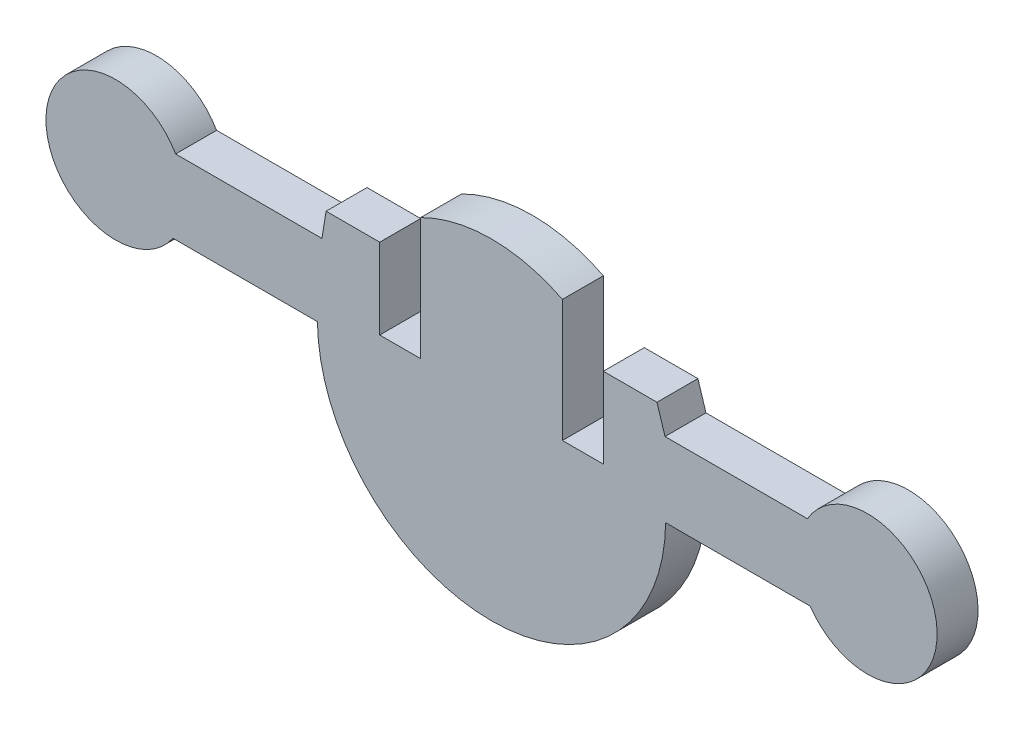
ISO-10303-21;
HEADER;
FILE_DESCRIPTION(('STEP AP214'),'2;1');
FILE_NAME('part.step','',(''),(''),'','','');
FILE_SCHEMA(('AUTOMOTIVE_DESIGN { 1 0 10303 214 1 1 1 1 }'));
ENDSEC;
DATA;
#1=APPLICATION_CONTEXT('core data for automotive mechanical design processes');
#2=APPLICATION_PROTOCOL_DEFINITION('international standard','automotive_design',2000,#1);
#3=PRODUCT_CONTEXT('',#1,'mechanical');
#4=PRODUCT('Part','Part','',(#3));
#5=PRODUCT_RELATED_PRODUCT_CATEGORY('part','',(#4));
#6=PRODUCT_DEFINITION_FORMATION('','',#4);
#7=PRODUCT_DEFINITION_CONTEXT('part definition',#1,'design');
#8=PRODUCT_DEFINITION('design','',#6,#7);
#9=PRODUCT_DEFINITION_SHAPE('','',#8);
#10=(LENGTH_UNIT() NAMED_UNIT(*) SI_UNIT(.MILLI.,.METRE.));
#11=(NAMED_UNIT(*) PLANE_ANGLE_UNIT() SI_UNIT($,.RADIAN.));
#12=(NAMED_UNIT(*) SI_UNIT($,.STERADIAN.) SOLID_ANGLE_UNIT());
#13=UNCERTAINTY_MEASURE_WITH_UNIT(LENGTH_MEASURE(1.E-05),#10,'distance_accuracy_value','');
#14=(GEOMETRIC_REPRESENTATION_CONTEXT(3) GLOBAL_UNCERTAINTY_ASSIGNED_CONTEXT((#13)) GLOBAL_UNIT_ASSIGNED_CONTEXT((#10,
#11,#12)) REPRESENTATION_CONTEXT('',''));
#15=CARTESIAN_POINT('',(0.,0.,0.));
#16=DIRECTION('',(0.,0.,1.));
#17=DIRECTION('',(1.,0.,0.));
#18=AXIS2_PLACEMENT_3D('',#15,#16,#17);
#19=CARTESIAN_POINT('',(380.162891568343,81.0232674362629,3.));
#20=DIRECTION('',(-0.954293006053872,-0.298872646116475,0.));
#21=DIRECTION('',(0.298872646116475,-0.954293006053873,0.));
#22=AXIS2_PLACEMENT_3D('',#19,#20,#21);
#23=PLANE('',#22);
#24=DIRECTION('',(-0.298872646116475,0.954293006053872,0.));
#25=VECTOR('',#24,1.);
#26=CARTESIAN_POINT('',(380.162891568343,81.0232674362629,0.));
#27=LINE('',#26,#25);
#28=CARTESIAN_POINT('',(380.162891568343,81.0232674362629,0.));
#29=VERTEX_POINT('',#28);
#30=CARTESIAN_POINT('',(379.573424934605,82.9054198954711,0.));
#31=VERTEX_POINT('',#30);
#32=EDGE_CURVE('E160',#29,#31,#27,.T.);
#33=ORIENTED_EDGE('',*,*,#32,.T.);
#34=DIRECTION('',(0.,0.,-1.));
#35=VECTOR('',#34,1.);
#36=CARTESIAN_POINT('',(379.573424934605,82.9054198954711,3.));
#37=LINE('',#36,#35);
#38=CARTESIAN_POINT('',(379.573424934605,82.9054198954711,3.));
#39=VERTEX_POINT('',#38);
#40=EDGE_CURVE('E11',#39,#31,#37,.T.);
#41=ORIENTED_EDGE('',*,*,#40,.F.);
#42=DIRECTION('',(-0.298872646116475,0.954293006053872,0.));
#43=VECTOR('',#42,1.);
#44=CARTESIAN_POINT('',(380.162891568343,81.0232674362629,3.));
#45=LINE('',#44,#43);
#46=CARTESIAN_POINT('',(380.162891568343,81.0232674362629,3.));
#47=VERTEX_POINT('',#46);
#48=EDGE_CURVE('E207',#47,#39,#45,.T.);
#49=ORIENTED_EDGE('',*,*,#48,.F.);
#50=DIRECTION('',(0.,0.,-1.));
#51=VECTOR('',#50,1.);
#52=CARTESIAN_POINT('',(380.162891568343,81.0232674362629,3.));
#53=LINE('',#52,#51);
#54=EDGE_CURVE('E173',#47,#29,#53,.T.);
#55=ORIENTED_EDGE('',*,*,#54,.T.);
#56=EDGE_LOOP('',(#33,#41,#49,#55));
#57=FACE_BOUND('',#56,.T.);
#58=ADVANCED_FACE('F32',(#57),#23,.F.);
#59=CARTESIAN_POINT('',(375.642420727752,82.9054198954711,3.));
#60=DIRECTION('',(0.,-1.,0.));
#61=DIRECTION('',(0.,0.,-1.));
#62=AXIS2_PLACEMENT_3D('',#59,#60,#61);
#63=PLANE('',#62);
#64=DIRECTION('',(-1.,0.,0.));
#65=VECTOR('',#64,1.);
#66=CARTESIAN_POINT('',(375.642420727752,82.9054198954711,0.));
#67=LINE('',#66,#65);
#68=CARTESIAN_POINT('',(375.642420727752,82.9054198954711,0.));
#69=VERTEX_POINT('',#68);
#70=EDGE_CURVE('E156',#31,#69,#67,.T.);
#71=ORIENTED_EDGE('',*,*,#70,.T.);
#72=DIRECTION('',(0.,0.,-1.));
#73=VECTOR('',#72,1.);
#74=CARTESIAN_POINT('',(375.642420727752,82.9054198954711,3.));
#75=LINE('',#74,#73);
#76=CARTESIAN_POINT('',(375.642420727752,82.9054198954711,3.));
#77=VERTEX_POINT('',#76);
#78=EDGE_CURVE('E39',#77,#69,#75,.T.);
#79=ORIENTED_EDGE('',*,*,#78,.F.);
#80=DIRECTION('',(-1.,0.,0.));
#81=VECTOR('',#80,1.);
#82=CARTESIAN_POINT('',(375.642420727752,82.9054198954711,3.));
#83=LINE('',#82,#81);
#84=EDGE_CURVE('E169',#39,#77,#83,.T.);
#85=ORIENTED_EDGE('',*,*,#84,.F.);
#86=ORIENTED_EDGE('',*,*,#40,.T.);
#87=EDGE_LOOP('',(#71,#79,#85,#86));
#88=FACE_BOUND('',#87,.T.);
#89=ADVANCED_FACE('F168',(#88),#63,.F.);
#90=CARTESIAN_POINT('',(375.642420727752,77.0100443366146,3.));
#91=DIRECTION('',(1.,0.,0.));
#92=DIRECTION('',(0.,0.,-1.));
#93=AXIS2_PLACEMENT_3D('',#90,#91,#92);
#94=PLANE('',#93);
#95=DIRECTION('',(0.,-1.,0.));
#96=VECTOR('',#95,1.);
#97=CARTESIAN_POINT('',(375.642420727752,77.0100443366146,0.));
#98=LINE('',#97,#96);
#99=CARTESIAN_POINT('',(375.642420727752,77.0100443366146,0.));
#100=VERTEX_POINT('',#99);
#101=EDGE_CURVE('E162',#69,#100,#98,.T.);
#102=ORIENTED_EDGE('',*,*,#101,.T.);
#103=DIRECTION('',(0.,0.,-1.));
#104=VECTOR('',#103,1.);
#105=CARTESIAN_POINT('',(375.642420727752,77.0100443366146,3.));
#106=LINE('',#105,#104);
#107=CARTESIAN_POINT('',(375.642420727752,77.0100443366146,3.));
#108=VERTEX_POINT('',#107);
#109=EDGE_CURVE('E283',#108,#100,#106,.T.);
#110=ORIENTED_EDGE('',*,*,#109,.F.);
#111=DIRECTION('',(0.,-1.,0.));
#112=VECTOR('',#111,1.);
#113=CARTESIAN_POINT('',(375.642420727752,77.0100443366146,3.));
#114=LINE('',#113,#112);
#115=EDGE_CURVE('E210',#77,#108,#114,.T.);
#116=ORIENTED_EDGE('',*,*,#115,.F.);
#117=ORIENTED_EDGE('',*,*,#78,.T.);
#118=EDGE_LOOP('',(#102,#110,#116,#117));
#119=FACE_BOUND('',#118,.T.);
#120=ADVANCED_FACE('F287',(#119),#94,.F.);
#121=CARTESIAN_POINT('',(372.642420727752,77.0100443366146,3.));
#122=DIRECTION('',(0.,-1.,0.));
#123=DIRECTION('',(0.,0.,-1.));
#124=AXIS2_PLACEMENT_3D('',#121,#122,#123);
#125=PLANE('',#124);
#126=DIRECTION('',(-1.,0.,0.));
#127=VECTOR('',#126,1.);
#128=CARTESIAN_POINT('',(372.642420727752,77.0100443366146,0.));
#129=LINE('',#128,#127);
#130=CARTESIAN_POINT('',(372.642420727752,77.0100443366146,0.));
#131=VERTEX_POINT('',#130);
#132=EDGE_CURVE('E177',#100,#131,#129,.T.);
#133=ORIENTED_EDGE('',*,*,#132,.T.);
#134=DIRECTION('',(0.,0.,-1.));
#135=VECTOR('',#134,1.);
#136=CARTESIAN_POINT('',(372.642420727752,77.0100443366146,3.));
#137=LINE('',#136,#135);
#138=CARTESIAN_POINT('',(372.642420727752,77.0100443366146,3.));
#139=VERTEX_POINT('',#138);
#140=EDGE_CURVE('E280',#139,#131,#137,.T.);
#141=ORIENTED_EDGE('',*,*,#140,.F.);
#142=DIRECTION('',(-1.,0.,0.));
#143=VECTOR('',#142,1.);
#144=CARTESIAN_POINT('',(372.642420727752,77.0100443366146,3.));
#145=LINE('',#144,#143);
#146=EDGE_CURVE('E212',#108,#139,#145,.T.);
#147=ORIENTED_EDGE('',*,*,#146,.F.);
#148=ORIENTED_EDGE('',*,*,#109,.T.);
#149=EDGE_LOOP('',(#133,#141,#147,#148));
#150=FACE_BOUND('',#149,.T.);
#151=ADVANCED_FACE('F295',(#150),#125,.F.);
#152=CARTESIAN_POINT('',(372.642420727752,85.9661384825004,3.));
#153=DIRECTION('',(-1.,0.,0.));
#154=DIRECTION('',(0.,0.,1.));
#155=AXIS2_PLACEMENT_3D('',#152,#153,#154);
#156=PLANE('',#155);
#157=DIRECTION('',(0.,1.,0.));
#158=VECTOR('',#157,1.);
#159=CARTESIAN_POINT('',(372.642420727752,85.9661384825004,0.));
#160=LINE('',#159,#158);
#161=CARTESIAN_POINT('',(372.642420727752,85.9661384825004,0.));
#162=VERTEX_POINT('',#161);
#163=EDGE_CURVE('E179',#131,#162,#160,.T.);
#164=ORIENTED_EDGE('',*,*,#163,.T.);
#165=DIRECTION('',(0.,0.,-1.));
#166=VECTOR('',#165,1.);
#167=CARTESIAN_POINT('',(372.642420727752,85.9661384825004,3.));
#168=LINE('',#167,#166);
#169=CARTESIAN_POINT('',(372.642420727752,85.9661384825004,3.));
#170=VERTEX_POINT('',#169);
#171=EDGE_CURVE('E277',#170,#162,#168,.T.);
#172=ORIENTED_EDGE('',*,*,#171,.F.);
#173=DIRECTION('',(0.,1.,0.));
#174=VECTOR('',#173,1.);
#175=CARTESIAN_POINT('',(372.642420727752,85.9661384825004,3.));
#176=LINE('',#175,#174);
#177=EDGE_CURVE('E214',#139,#170,#176,.T.);
#178=ORIENTED_EDGE('',*,*,#177,.F.);
#179=ORIENTED_EDGE('',*,*,#140,.T.);
#180=EDGE_LOOP('',(#164,#172,#178,#179));
#181=FACE_BOUND('',#180,.T.);
#182=ADVANCED_FACE('F298',(#181),#156,.F.);
#183=CARTESIAN_POINT('',(367.447420727751,75.7241856556639,3.));
#184=DIRECTION('',(0.,0.,-1.));
#185=DIRECTION('',(-1.,0.,0.));
#186=AXIS2_PLACEMENT_3D('',#183,#184,#185);
#187=CYLINDRICAL_SURFACE('',#186,11.4841465815768);
#188=CARTESIAN_POINT('',(367.447420727751,75.7241856556639,0.));
#189=DIRECTION('',(0.,0.,1.));
#190=DIRECTION('',(-1.,0.,0.));
#191=AXIS2_PLACEMENT_3D('',#188,#189,#190);
#192=CIRCLE('',#191,11.4841465815768);
#193=CARTESIAN_POINT('',(362.252420727751,85.9661384825004,0.));
#194=VERTEX_POINT('',#193);
#195=EDGE_CURVE('E181',#162,#194,#192,.T.);
#196=ORIENTED_EDGE('',*,*,#195,.T.);
#197=DIRECTION('',(0.,0.,-1.));
#198=VECTOR('',#197,1.);
#199=CARTESIAN_POINT('',(362.252420727751,85.9661384825004,3.));
#200=LINE('',#199,#198);
#201=CARTESIAN_POINT('',(362.252420727751,85.9661384825004,3.));
#202=VERTEX_POINT('',#201);
#203=EDGE_CURVE('E274',#202,#194,#200,.T.);
#204=ORIENTED_EDGE('',*,*,#203,.F.);
#205=CARTESIAN_POINT('',(367.447420727751,75.7241856556639,3.));
#206=DIRECTION('',(0.,0.,1.));
#207=DIRECTION('',(-1.,0.,0.));
#208=AXIS2_PLACEMENT_3D('',#205,#206,#207);
#209=CIRCLE('',#208,11.4841465815768);
#210=EDGE_CURVE('E216',#170,#202,#209,.T.);
#211=ORIENTED_EDGE('',*,*,#210,.F.);
#212=ORIENTED_EDGE('',*,*,#171,.T.);
#213=EDGE_LOOP('',(#196,#204,#211,#212));
#214=FACE_BOUND('',#213,.T.);
#215=ADVANCED_FACE('F303',(#214),#187,.T.);
#216=CARTESIAN_POINT('',(362.252420727751,85.9661384825004,3.));
#217=DIRECTION('',(1.,0.,0.));
#218=DIRECTION('',(0.,0.,-1.));
#219=AXIS2_PLACEMENT_3D('',#216,#217,#218);
#220=PLANE('',#219);
#221=DIRECTION('',(0.,-1.,0.));
#222=VECTOR('',#221,1.);
#223=CARTESIAN_POINT('',(362.252420727751,85.9661384825004,0.));
#224=LINE('',#223,#222);
#225=CARTESIAN_POINT('',(362.252420727751,77.0100443366146,0.));
#226=VERTEX_POINT('',#225);
#227=EDGE_CURVE('E183',#194,#226,#224,.T.);
#228=ORIENTED_EDGE('',*,*,#227,.T.);
#229=DIRECTION('',(0.,0.,-1.));
#230=VECTOR('',#229,1.);
#231=CARTESIAN_POINT('',(362.252420727751,77.0100443366146,3.));
#232=LINE('',#231,#230);
#233=CARTESIAN_POINT('',(362.252420727751,77.0100443366146,3.));
#234=VERTEX_POINT('',#233);
#235=EDGE_CURVE('E271',#234,#226,#232,.T.);
#236=ORIENTED_EDGE('',*,*,#235,.F.);
#237=DIRECTION('',(0.,-1.,0.));
#238=VECTOR('',#237,1.);
#239=CARTESIAN_POINT('',(362.252420727751,85.9661384825004,3.));
#240=LINE('',#239,#238);
#241=EDGE_CURVE('E218',#202,#234,#240,.T.);
#242=ORIENTED_EDGE('',*,*,#241,.F.);
#243=ORIENTED_EDGE('',*,*,#203,.T.);
#244=EDGE_LOOP('',(#228,#236,#242,#243));
#245=FACE_BOUND('',#244,.T.);
#246=ADVANCED_FACE('F309',(#245),#220,.F.);
#247=CARTESIAN_POINT('',(362.252420727751,77.0100443366146,3.));
#248=DIRECTION('',(0.,-1.,0.));
#249=DIRECTION('',(0.,0.,-1.));
#250=AXIS2_PLACEMENT_3D('',#247,#248,#249);
#251=PLANE('',#250);
#252=DIRECTION('',(-1.,0.,0.));
#253=VECTOR('',#252,1.);
#254=CARTESIAN_POINT('',(362.252420727751,77.0100443366146,0.));
#255=LINE('',#254,#253);
#256=CARTESIAN_POINT('',(359.252420727751,77.0100443366146,0.));
#257=VERTEX_POINT('',#256);
#258=EDGE_CURVE('E185',#226,#257,#255,.T.);
#259=ORIENTED_EDGE('',*,*,#258,.T.);
#260=DIRECTION('',(0.,0.,-1.));
#261=VECTOR('',#260,1.);
#262=CARTESIAN_POINT('',(359.252420727751,77.0100443366146,3.));
#263=LINE('',#262,#261);
#264=CARTESIAN_POINT('',(359.252420727751,77.0100443366146,3.));
#265=VERTEX_POINT('',#264);
#266=EDGE_CURVE('E268',#265,#257,#263,.T.);
#267=ORIENTED_EDGE('',*,*,#266,.F.);
#268=DIRECTION('',(-1.,0.,0.));
#269=VECTOR('',#268,1.);
#270=CARTESIAN_POINT('',(362.252420727751,77.0100443366146,3.));
#271=LINE('',#270,#269);
#272=EDGE_CURVE('E220',#234,#265,#271,.T.);
#273=ORIENTED_EDGE('',*,*,#272,.F.);
#274=ORIENTED_EDGE('',*,*,#235,.T.);
#275=EDGE_LOOP('',(#259,#267,#273,#274));
#276=FACE_BOUND('',#275,.T.);
#277=ADVANCED_FACE('F313',(#276),#251,.F.);
#278=CARTESIAN_POINT('',(359.252420727751,77.0100443366146,3.));
#279=DIRECTION('',(-1.,0.,0.));
#280=DIRECTION('',(0.,0.,1.));
#281=AXIS2_PLACEMENT_3D('',#278,#279,#280);
#282=PLANE('',#281);
#283=DIRECTION('',(0.,1.,0.));
#284=VECTOR('',#283,1.);
#285=CARTESIAN_POINT('',(359.252420727751,77.0100443366146,0.));
#286=LINE('',#285,#284);
#287=CARTESIAN_POINT('',(359.252420727751,82.9054198954711,0.));
#288=VERTEX_POINT('',#287);
#289=EDGE_CURVE('E187',#257,#288,#286,.T.);
#290=ORIENTED_EDGE('',*,*,#289,.T.);
#291=DIRECTION('',(0.,0.,-1.));
#292=VECTOR('',#291,1.);
#293=CARTESIAN_POINT('',(359.252420727751,82.9054198954711,3.));
#294=LINE('',#293,#292);
#295=CARTESIAN_POINT('',(359.252420727751,82.9054198954711,3.));
#296=VERTEX_POINT('',#295);
#297=EDGE_CURVE('E265',#296,#288,#294,.T.);
#298=ORIENTED_EDGE('',*,*,#297,.F.);
#299=DIRECTION('',(0.,1.,0.));
#300=VECTOR('',#299,1.);
#301=CARTESIAN_POINT('',(359.252420727751,77.0100443366146,3.));
#302=LINE('',#301,#300);
#303=EDGE_CURVE('E222',#265,#296,#302,.T.);
#304=ORIENTED_EDGE('',*,*,#303,.F.);
#305=ORIENTED_EDGE('',*,*,#266,.T.);
#306=EDGE_LOOP('',(#290,#298,#304,#305));
#307=FACE_BOUND('',#306,.T.);
#308=ADVANCED_FACE('F318',(#307),#282,.F.);
#309=CARTESIAN_POINT('',(359.252420727751,82.9054198954711,3.));
#310=DIRECTION('',(0.,-1.,0.));
#311=DIRECTION('',(1.,0.,0.));
#312=AXIS2_PLACEMENT_3D('',#309,#310,#311);
#313=PLANE('',#312);
#314=DIRECTION('',(-1.,0.,0.));
#315=VECTOR('',#314,1.);
#316=CARTESIAN_POINT('',(359.252420727751,82.9054198954711,0.));
#317=LINE('',#316,#315);
#318=CARTESIAN_POINT('',(355.321416520898,82.9054198954711,0.));
#319=VERTEX_POINT('',#318);
#320=EDGE_CURVE('E189',#288,#319,#317,.T.);
#321=ORIENTED_EDGE('',*,*,#320,.T.);
#322=DIRECTION('',(0.,0.,-1.));
#323=VECTOR('',#322,1.);
#324=CARTESIAN_POINT('',(355.321416520898,82.9054198954711,3.));
#325=LINE('',#324,#323);
#326=CARTESIAN_POINT('',(355.321416520898,82.9054198954711,3.));
#327=VERTEX_POINT('',#326);
#328=EDGE_CURVE('E262',#327,#319,#325,.T.);
#329=ORIENTED_EDGE('',*,*,#328,.F.);
#330=DIRECTION('',(-1.,0.,0.));
#331=VECTOR('',#330,1.);
#332=CARTESIAN_POINT('',(359.252420727751,82.9054198954711,3.));
#333=LINE('',#332,#331);
#334=EDGE_CURVE('E224',#296,#327,#333,.T.);
#335=ORIENTED_EDGE('',*,*,#334,.F.);
#336=ORIENTED_EDGE('',*,*,#297,.T.);
#337=EDGE_LOOP('',(#321,#329,#335,#336));
#338=FACE_BOUND('',#337,.T.);
#339=ADVANCED_FACE('F324',(#338),#313,.F.);
#340=CARTESIAN_POINT('',(355.018550657418,81.0232674362629,3.));
#341=DIRECTION('',(0.987299363865239,-0.15887091021107,0.));
#342=DIRECTION('',(0.15887091021107,0.987299363865239,0.));
#343=AXIS2_PLACEMENT_3D('',#340,#341,#342);
#344=PLANE('',#343);
#345=DIRECTION('',(-0.15887091021107,-0.987299363865239,0.));
#346=VECTOR('',#345,1.);
#347=CARTESIAN_POINT('',(355.018550657418,81.0232674362629,0.));
#348=LINE('',#347,#346);
#349=CARTESIAN_POINT('',(355.018550657418,81.0232674362629,0.));
#350=VERTEX_POINT('',#349);
#351=EDGE_CURVE('E191',#319,#350,#348,.T.);
#352=ORIENTED_EDGE('',*,*,#351,.T.);
#353=DIRECTION('',(0.,0.,-1.));
#354=VECTOR('',#353,1.);
#355=CARTESIAN_POINT('',(355.018550657418,81.0232674362629,3.));
#356=LINE('',#355,#354);
#357=CARTESIAN_POINT('',(355.018550657418,81.0232674362629,3.));
#358=VERTEX_POINT('',#357);
#359=EDGE_CURVE('E259',#358,#350,#356,.T.);
#360=ORIENTED_EDGE('',*,*,#359,.F.);
#361=DIRECTION('',(-0.15887091021107,-0.987299363865239,0.));
#362=VECTOR('',#361,1.);
#363=CARTESIAN_POINT('',(355.018550657418,81.0232674362629,3.));
#364=LINE('',#363,#362);
#365=EDGE_CURVE('E226',#327,#358,#364,.T.);
#366=ORIENTED_EDGE('',*,*,#365,.F.);
#367=ORIENTED_EDGE('',*,*,#328,.T.);
#368=EDGE_LOOP('',(#352,#360,#366,#367));
#369=FACE_BOUND('',#368,.T.);
#370=ADVANCED_FACE('F328',(#369),#344,.F.);
#371=CARTESIAN_POINT('',(355.018550657418,81.0232674362629,3.));
#372=DIRECTION('',(0.,-1.,0.));
#373=DIRECTION('',(1.,0.,0.));
#374=AXIS2_PLACEMENT_3D('',#371,#372,#373);
#375=PLANE('',#374);
#376=DIRECTION('',(-1.,0.,0.));
#377=VECTOR('',#376,1.);
#378=CARTESIAN_POINT('',(355.018550657418,81.0232674362629,0.));
#379=LINE('',#378,#377);
#380=CARTESIAN_POINT('',(344.295821617079,81.0232674362629,0.));
#381=VERTEX_POINT('',#380);
#382=EDGE_CURVE('E193',#350,#381,#379,.T.);
#383=ORIENTED_EDGE('',*,*,#382,.T.);
#384=DIRECTION('',(0.,0.,-1.));
#385=VECTOR('',#384,1.);
#386=CARTESIAN_POINT('',(344.295821617079,81.0232674362629,3.));
#387=LINE('',#386,#385);
#388=CARTESIAN_POINT('',(344.295821617079,81.0232674362629,3.));
#389=VERTEX_POINT('',#388);
#390=EDGE_CURVE('E256',#389,#381,#387,.T.);
#391=ORIENTED_EDGE('',*,*,#390,.F.);
#392=DIRECTION('',(-1.,0.,0.));
#393=VECTOR('',#392,1.);
#394=CARTESIAN_POINT('',(355.018550657418,81.0232674362629,3.));
#395=LINE('',#394,#393);
#396=EDGE_CURVE('E228',#358,#389,#395,.T.);
#397=ORIENTED_EDGE('',*,*,#396,.F.);
#398=ORIENTED_EDGE('',*,*,#359,.T.);
#399=EDGE_LOOP('',(#383,#391,#397,#398));
#400=FACE_BOUND('',#399,.T.);
#401=ADVANCED_FACE('F333',(#400),#375,.F.);
#402=CARTESIAN_POINT('',(339.890006115699,78.4544585123626,3.));
#403=DIRECTION('',(0.,0.,-1.));
#404=DIRECTION('',(-1.,0.,0.));
#405=AXIS2_PLACEMENT_3D('',#402,#403,#404);
#406=CYLINDRICAL_SURFACE('',#405,5.09999897252048);
#407=CARTESIAN_POINT('',(339.890006115699,78.4544585123626,0.));
#408=DIRECTION('',(0.,0.,1.));
#409=DIRECTION('',(1.,0.,0.));
#410=AXIS2_PLACEMENT_3D('',#407,#408,#409);
#411=CIRCLE('',#410,5.09999897252048);
#412=CARTESIAN_POINT('',(344.099744740645,75.5755541670689,0.));
#413=VERTEX_POINT('',#412);
#414=EDGE_CURVE('E195',#381,#413,#411,.T.);
#415=ORIENTED_EDGE('',*,*,#414,.T.);
#416=DIRECTION('',(0.,0.,-1.));
#417=VECTOR('',#416,1.);
#418=CARTESIAN_POINT('',(344.099744740645,75.5755541670689,3.));
#419=LINE('',#418,#417);
#420=CARTESIAN_POINT('',(344.099744740645,75.5755541670689,3.));
#421=VERTEX_POINT('',#420);
#422=EDGE_CURVE('E253',#421,#413,#419,.T.);
#423=ORIENTED_EDGE('',*,*,#422,.F.);
#424=CARTESIAN_POINT('',(339.890006115699,78.4544585123626,3.));
#425=DIRECTION('',(0.,0.,1.));
#426=DIRECTION('',(1.,0.,0.));
#427=AXIS2_PLACEMENT_3D('',#424,#425,#426);
#428=CIRCLE('',#427,5.09999897252048);
#429=EDGE_CURVE('E230',#389,#421,#428,.T.);
#430=ORIENTED_EDGE('',*,*,#429,.F.);
#431=ORIENTED_EDGE('',*,*,#390,.T.);
#432=EDGE_LOOP('',(#415,#423,#430,#431));
#433=FACE_BOUND('',#432,.T.);
#434=ADVANCED_FACE('F339',(#433),#406,.T.);
#435=CARTESIAN_POINT('',(354.687028784585,75.575554167069,3.));
#436=DIRECTION('',(0.,1.,0.));
#437=DIRECTION('',(-1.,0.,0.));
#438=AXIS2_PLACEMENT_3D('',#435,#436,#437);
#439=PLANE('',#438);
#440=DIRECTION('',(1.,0.,0.));
#441=VECTOR('',#440,1.);
#442=CARTESIAN_POINT('',(354.687028784585,75.575554167069,0.));
#443=LINE('',#442,#441);
#444=CARTESIAN_POINT('',(354.687028784585,75.575554167069,0.));
#445=VERTEX_POINT('',#444);
#446=EDGE_CURVE('E197',#413,#445,#443,.T.);
#447=ORIENTED_EDGE('',*,*,#446,.T.);
#448=DIRECTION('',(0.,0.,-1.));
#449=VECTOR('',#448,1.);
#450=CARTESIAN_POINT('',(354.687028784585,75.575554167069,3.));
#451=LINE('',#450,#449);
#452=CARTESIAN_POINT('',(354.687028784585,75.575554167069,3.));
#453=VERTEX_POINT('',#452);
#454=EDGE_CURVE('E250',#453,#445,#451,.T.);
#455=ORIENTED_EDGE('',*,*,#454,.F.);
#456=DIRECTION('',(1.,0.,0.));
#457=VECTOR('',#456,1.);
#458=CARTESIAN_POINT('',(354.687028784585,75.575554167069,3.));
#459=LINE('',#458,#457);
#460=EDGE_CURVE('E232',#421,#453,#459,.T.);
#461=ORIENTED_EDGE('',*,*,#460,.F.);
#462=ORIENTED_EDGE('',*,*,#422,.T.);
#463=EDGE_LOOP('',(#447,#455,#461,#462));
#464=FACE_BOUND('',#463,.T.);
#465=ADVANCED_FACE('F343',(#464),#439,.F.);
#466=CARTESIAN_POINT('',(367.447420727751,75.7241856556639,3.));
#467=DIRECTION('',(0.,0.,-1.));
#468=DIRECTION('',(-1.,0.,0.));
#469=AXIS2_PLACEMENT_3D('',#466,#467,#468);
#470=CYLINDRICAL_SURFACE('',#469,12.7612575345313);
#471=CARTESIAN_POINT('',(367.447420727751,75.7241856556639,0.));
#472=DIRECTION('',(0.,0.,1.));
#473=DIRECTION('',(1.,0.,0.));
#474=AXIS2_PLACEMENT_3D('',#471,#472,#473);
#475=CIRCLE('',#474,12.7612575345313);
#476=CARTESIAN_POINT('',(380.207812670918,75.575554167069,0.));
#477=VERTEX_POINT('',#476);
#478=EDGE_CURVE('E199',#445,#477,#475,.T.);
#479=ORIENTED_EDGE('',*,*,#478,.T.);
#480=DIRECTION('',(0.,0.,-1.));
#481=VECTOR('',#480,1.);
#482=CARTESIAN_POINT('',(380.207812670918,75.575554167069,3.));
#483=LINE('',#482,#481);
#484=CARTESIAN_POINT('',(380.207812670918,75.575554167069,3.));
#485=VERTEX_POINT('',#484);
#486=EDGE_CURVE('E247',#485,#477,#483,.T.);
#487=ORIENTED_EDGE('',*,*,#486,.F.);
#488=CARTESIAN_POINT('',(367.447420727751,75.7241856556639,3.));
#489=DIRECTION('',(0.,0.,1.));
#490=DIRECTION('',(1.,0.,0.));
#491=AXIS2_PLACEMENT_3D('',#488,#489,#490);
#492=CIRCLE('',#491,12.7612575345313);
#493=EDGE_CURVE('E234',#453,#485,#492,.T.);
#494=ORIENTED_EDGE('',*,*,#493,.F.);
#495=ORIENTED_EDGE('',*,*,#454,.T.);
#496=EDGE_LOOP('',(#479,#487,#494,#495));
#497=FACE_BOUND('',#496,.T.);
#498=ADVANCED_FACE('F348',(#497),#470,.T.);
#499=CARTESIAN_POINT('',(380.207812670918,75.575554167069,3.));
#500=DIRECTION('',(0.,1.,0.));
#501=DIRECTION('',(-1.,0.,0.));
#502=AXIS2_PLACEMENT_3D('',#499,#500,#501);
#503=PLANE('',#502);
#504=DIRECTION('',(1.,0.,0.));
#505=VECTOR('',#504,1.);
#506=CARTESIAN_POINT('',(380.207812670918,75.575554167069,0.));
#507=LINE('',#506,#505);
#508=CARTESIAN_POINT('',(390.795096714858,75.5755541670689,0.));
#509=VERTEX_POINT('',#508);
#510=EDGE_CURVE('E201',#477,#509,#507,.T.);
#511=ORIENTED_EDGE('',*,*,#510,.T.);
#512=DIRECTION('',(0.,0.,-1.));
#513=VECTOR('',#512,1.);
#514=CARTESIAN_POINT('',(390.795096714858,75.5755541670689,3.));
#515=LINE('',#514,#513);
#516=CARTESIAN_POINT('',(390.795096714858,75.5755541670689,3.));
#517=VERTEX_POINT('',#516);
#518=EDGE_CURVE('E244',#517,#509,#515,.T.);
#519=ORIENTED_EDGE('',*,*,#518,.F.);
#520=DIRECTION('',(1.,0.,0.));
#521=VECTOR('',#520,1.);
#522=CARTESIAN_POINT('',(380.207812670918,75.575554167069,3.));
#523=LINE('',#522,#521);
#524=EDGE_CURVE('E236',#485,#517,#523,.T.);
#525=ORIENTED_EDGE('',*,*,#524,.F.);
#526=ORIENTED_EDGE('',*,*,#486,.T.);
#527=EDGE_LOOP('',(#511,#519,#525,#526));
#528=FACE_BOUND('',#527,.T.);
#529=ADVANCED_FACE('F352',(#528),#503,.F.);
#530=CARTESIAN_POINT('',(395.004835339804,78.4544585123626,3.));
#531=DIRECTION('',(0.,0.,-1.));
#532=DIRECTION('',(-1.,0.,0.));
#533=AXIS2_PLACEMENT_3D('',#530,#531,#532);
#534=CYLINDRICAL_SURFACE('',#533,5.09999897252048);
#535=CARTESIAN_POINT('',(395.004835339804,78.4544585123626,0.));
#536=DIRECTION('',(0.,0.,1.));
#537=DIRECTION('',(-1.,0.,0.));
#538=AXIS2_PLACEMENT_3D('',#535,#536,#537);
#539=CIRCLE('',#538,5.09999897252048);
#540=CARTESIAN_POINT('',(390.599019838424,81.0232674362629,0.));
#541=VERTEX_POINT('',#540);
#542=EDGE_CURVE('E203',#509,#541,#539,.T.);
#543=ORIENTED_EDGE('',*,*,#542,.T.);
#544=DIRECTION('',(0.,0.,-1.));
#545=VECTOR('',#544,1.);
#546=CARTESIAN_POINT('',(390.599019838424,81.0232674362629,3.));
#547=LINE('',#546,#545);
#548=CARTESIAN_POINT('',(390.599019838424,81.0232674362629,3.));
#549=VERTEX_POINT('',#548);
#550=EDGE_CURVE('E241',#549,#541,#547,.T.);
#551=ORIENTED_EDGE('',*,*,#550,.F.);
#552=CARTESIAN_POINT('',(395.004835339804,78.4544585123626,3.));
#553=DIRECTION('',(0.,0.,1.));
#554=DIRECTION('',(-1.,0.,0.));
#555=AXIS2_PLACEMENT_3D('',#552,#553,#554);
#556=CIRCLE('',#555,5.09999897252048);
#557=EDGE_CURVE('E51',#517,#549,#556,.T.);
#558=ORIENTED_EDGE('',*,*,#557,.F.);
#559=ORIENTED_EDGE('',*,*,#518,.T.);
#560=EDGE_LOOP('',(#543,#551,#558,#559));
#561=FACE_BOUND('',#560,.T.);
#562=ADVANCED_FACE('F356',(#561),#534,.T.);
#563=CARTESIAN_POINT('',(380.162891568343,81.0232674362629,3.));
#564=DIRECTION('',(0.,-1.,0.));
#565=DIRECTION('',(1.,0.,0.));
#566=AXIS2_PLACEMENT_3D('',#563,#564,#565);
#567=PLANE('',#566);
#568=DIRECTION('',(-1.,0.,0.));
#569=VECTOR('',#568,1.);
#570=CARTESIAN_POINT('',(380.162891568343,81.0232674362629,0.));
#571=LINE('',#570,#569);
#572=EDGE_CURVE('E205',#541,#29,#571,.T.);
#573=ORIENTED_EDGE('',*,*,#572,.T.);
#574=ORIENTED_EDGE('',*,*,#54,.F.);
#575=DIRECTION('',(-1.,0.,0.));
#576=VECTOR('',#575,1.);
#577=CARTESIAN_POINT('',(380.162891568343,81.0232674362629,3.));
#578=LINE('',#577,#576);
#579=EDGE_CURVE('E46',#549,#47,#578,.T.);
#580=ORIENTED_EDGE('',*,*,#579,.F.);
#581=ORIENTED_EDGE('',*,*,#550,.T.);
#582=EDGE_LOOP('',(#573,#574,#580,#581));
#583=FACE_BOUND('',#582,.T.);
#584=ADVANCED_FACE('F358',(#583),#567,.F.);
#585=CARTESIAN_POINT('',(367.447420727751,75.7241856556639,3.));
#586=DIRECTION('',(0.,0.,-1.));
#587=DIRECTION('',(-1.,0.,0.));
#588=AXIS2_PLACEMENT_3D('',#585,#586,#587);
#589=PLANE('',#588);
#590=ORIENTED_EDGE('',*,*,#48,.T.);
#591=ORIENTED_EDGE('',*,*,#84,.T.);
#592=ORIENTED_EDGE('',*,*,#115,.T.);
#593=ORIENTED_EDGE('',*,*,#146,.T.);
#594=ORIENTED_EDGE('',*,*,#177,.T.);
#595=ORIENTED_EDGE('',*,*,#210,.T.);
#596=ORIENTED_EDGE('',*,*,#241,.T.);
#597=ORIENTED_EDGE('',*,*,#272,.T.);
#598=ORIENTED_EDGE('',*,*,#303,.T.);
#599=ORIENTED_EDGE('',*,*,#334,.T.);
#600=ORIENTED_EDGE('',*,*,#365,.T.);
#601=ORIENTED_EDGE('',*,*,#396,.T.);
#602=ORIENTED_EDGE('',*,*,#429,.T.);
#603=ORIENTED_EDGE('',*,*,#460,.T.);
#604=ORIENTED_EDGE('',*,*,#493,.T.);
#605=ORIENTED_EDGE('',*,*,#524,.T.);
#606=ORIENTED_EDGE('',*,*,#557,.T.);
#607=ORIENTED_EDGE('',*,*,#579,.T.);
#608=EDGE_LOOP('',(#590,#591,#592,#593,#594,#595,#596,#597,#598,#599,#600,#601,#602,#603,#604,
#605,#606,#607));
#609=FACE_BOUND('',#608,.T.);
#610=ADVANCED_FACE('F290',(#609),#589,.F.);
#611=CARTESIAN_POINT('',(367.447420727751,75.7241856556639,0.));
#612=DIRECTION('',(0.,0.,-1.));
#613=DIRECTION('',(-1.,0.,0.));
#614=AXIS2_PLACEMENT_3D('',#611,#612,#613);
#615=PLANE('',#614);
#616=ORIENTED_EDGE('',*,*,#32,.F.);
#617=ORIENTED_EDGE('',*,*,#572,.F.);
#618=ORIENTED_EDGE('',*,*,#542,.F.);
#619=ORIENTED_EDGE('',*,*,#510,.F.);
#620=ORIENTED_EDGE('',*,*,#478,.F.);
#621=ORIENTED_EDGE('',*,*,#446,.F.);
#622=ORIENTED_EDGE('',*,*,#414,.F.);
#623=ORIENTED_EDGE('',*,*,#382,.F.);
#624=ORIENTED_EDGE('',*,*,#351,.F.);
#625=ORIENTED_EDGE('',*,*,#320,.F.);
#626=ORIENTED_EDGE('',*,*,#289,.F.);
#627=ORIENTED_EDGE('',*,*,#258,.F.);
#628=ORIENTED_EDGE('',*,*,#227,.F.);
#629=ORIENTED_EDGE('',*,*,#195,.F.);
#630=ORIENTED_EDGE('',*,*,#163,.F.);
#631=ORIENTED_EDGE('',*,*,#132,.F.);
#632=ORIENTED_EDGE('',*,*,#101,.F.);
#633=ORIENTED_EDGE('',*,*,#70,.F.);
#634=EDGE_LOOP('',(#616,#617,#618,#619,#620,#621,#622,#623,#624,#625,#626,#627,#628,#629,#630,
#631,#632,#633));
#635=FACE_BOUND('',#634,.T.);
#636=ADVANCED_FACE('F157',(#635),#615,.T.);
#637=CLOSED_SHELL('',(#58,#89,#120,#151,#182,#215,#246,#277,#308,#339,#370,#401,#434,#465,#498,
#529,#562,#584,#610,#636));
#638=MANIFOLD_SOLID_BREP('B2',#637);
#639=ADVANCED_BREP_SHAPE_REPRESENTATION('',(#18,#638),#14);
#640=SHAPE_DEFINITION_REPRESENTATION(#9,#639);
ENDSEC;
END-ISO-10303-21;
